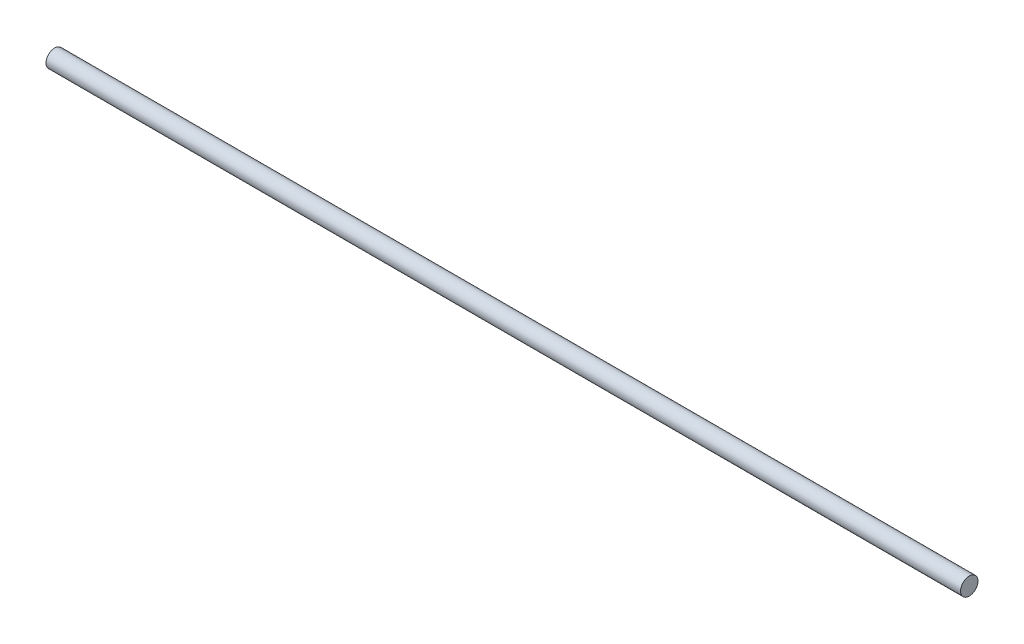
ISO-10303-21;
HEADER;
FILE_DESCRIPTION(('STEP AP214'),'2;1');
FILE_NAME('part.step','',(''),(''),'','','');
FILE_SCHEMA(('AUTOMOTIVE_DESIGN { 1 0 10303 214 1 1 1 1 }'));
ENDSEC;
DATA;
#1=APPLICATION_CONTEXT('core data for automotive mechanical design processes');
#2=APPLICATION_PROTOCOL_DEFINITION('international standard','automotive_design',2000,#1);
#3=PRODUCT_CONTEXT('',#1,'mechanical');
#4=PRODUCT('Part','Part','',(#3));
#5=PRODUCT_RELATED_PRODUCT_CATEGORY('part','',(#4));
#6=PRODUCT_DEFINITION_FORMATION('','',#4);
#7=PRODUCT_DEFINITION_CONTEXT('part definition',#1,'design');
#8=PRODUCT_DEFINITION('design','',#6,#7);
#9=PRODUCT_DEFINITION_SHAPE('','',#8);
#10=(LENGTH_UNIT() NAMED_UNIT(*) SI_UNIT(.MILLI.,.METRE.));
#11=(NAMED_UNIT(*) PLANE_ANGLE_UNIT() SI_UNIT($,.RADIAN.));
#12=(NAMED_UNIT(*) SI_UNIT($,.STERADIAN.) SOLID_ANGLE_UNIT());
#13=UNCERTAINTY_MEASURE_WITH_UNIT(LENGTH_MEASURE(1.E-05),#10,'distance_accuracy_value','');
#14=(GEOMETRIC_REPRESENTATION_CONTEXT(3) GLOBAL_UNCERTAINTY_ASSIGNED_CONTEXT((#13)) GLOBAL_UNIT_ASSIGNED_CONTEXT((#10,
#11,#12)) REPRESENTATION_CONTEXT('',''));
#15=CARTESIAN_POINT('',(0.,0.,0.));
#16=DIRECTION('',(0.,0.,1.));
#17=DIRECTION('',(1.,0.,0.));
#18=AXIS2_PLACEMENT_3D('',#15,#16,#17);
#19=CARTESIAN_POINT('',(420.,0.,0.));
#20=DIRECTION('',(-1.,0.,0.));
#21=DIRECTION('',(0.,0.,1.));
#22=AXIS2_PLACEMENT_3D('',#19,#20,#21);
#23=CYLINDRICAL_SURFACE('',#22,4.);
#24=CARTESIAN_POINT('',(420.,0.,0.));
#25=DIRECTION('',(1.,0.,0.));
#26=DIRECTION('',(0.,0.,-1.));
#27=AXIS2_PLACEMENT_3D('',#24,#25,#26);
#28=CIRCLE('',#27,4.);
#29=CARTESIAN_POINT('',(420.,0.,-4.));
#30=VERTEX_POINT('',#29);
#31=EDGE_CURVE('E10',#30,#30,#28,.T.);
#32=ORIENTED_EDGE('',*,*,#31,.F.);
#33=EDGE_LOOP('',(#32));
#34=FACE_BOUND('',#33,.T.);
#35=CARTESIAN_POINT('',(0.,0.,0.));
#36=DIRECTION('',(1.,0.,0.));
#37=DIRECTION('',(0.,0.,-1.));
#38=AXIS2_PLACEMENT_3D('',#35,#36,#37);
#39=CIRCLE('',#38,4.);
#40=CARTESIAN_POINT('',(0.,0.,-4.));
#41=VERTEX_POINT('',#40);
#42=EDGE_CURVE('E33',#41,#41,#39,.T.);
#43=ORIENTED_EDGE('',*,*,#42,.T.);
#44=EDGE_LOOP('',(#43));
#45=FACE_BOUND('',#44,.T.);
#46=ADVANCED_FACE('F30',(#34,#45),#23,.T.);
#47=CARTESIAN_POINT('',(420.,0.,0.));
#48=DIRECTION('',(1.,0.,0.));
#49=DIRECTION('',(0.,0.,-1.));
#50=AXIS2_PLACEMENT_3D('',#47,#48,#49);
#51=PLANE('',#50);
#52=ORIENTED_EDGE('',*,*,#31,.T.);
#53=EDGE_LOOP('',(#52));
#54=FACE_BOUND('',#53,.T.);
#55=ADVANCED_FACE('F45',(#54),#51,.T.);
#56=CARTESIAN_POINT('',(0.,0.,0.));
#57=DIRECTION('',(1.,0.,0.));
#58=DIRECTION('',(0.,0.,-1.));
#59=AXIS2_PLACEMENT_3D('',#56,#57,#58);
#60=PLANE('',#59);
#61=ORIENTED_EDGE('',*,*,#42,.F.);
#62=EDGE_LOOP('',(#61));
#63=FACE_BOUND('',#62,.T.);
#64=ADVANCED_FACE('F43',(#63),#60,.F.);
#65=CLOSED_SHELL('',(#46,#55,#64));
#66=MANIFOLD_SOLID_BREP('B2',#65);
#67=ADVANCED_BREP_SHAPE_REPRESENTATION('',(#18,#66),#14);
#68=SHAPE_DEFINITION_REPRESENTATION(#9,#67);
ENDSEC;
END-ISO-10303-21;
